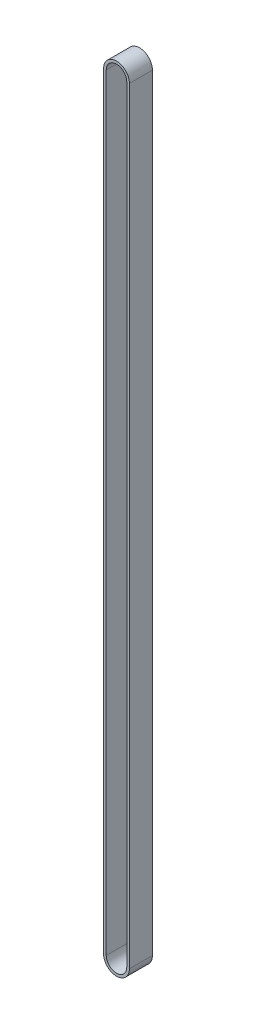
ISO-10303-21;
HEADER;
FILE_DESCRIPTION(('STEP AP214'),'2;1');
FILE_NAME('part.step','',(''),(''),'','','');
FILE_SCHEMA(('AUTOMOTIVE_DESIGN { 1 0 10303 214 1 1 1 1 }'));
ENDSEC;
DATA;
#1=APPLICATION_CONTEXT('core data for automotive mechanical design processes');
#2=APPLICATION_PROTOCOL_DEFINITION('international standard','automotive_design',2000,#1);
#3=PRODUCT_CONTEXT('',#1,'mechanical');
#4=PRODUCT('Part','Part','',(#3));
#5=PRODUCT_RELATED_PRODUCT_CATEGORY('part','',(#4));
#6=PRODUCT_DEFINITION_FORMATION('','',#4);
#7=PRODUCT_DEFINITION_CONTEXT('part definition',#1,'design');
#8=PRODUCT_DEFINITION('design','',#6,#7);
#9=PRODUCT_DEFINITION_SHAPE('','',#8);
#10=(LENGTH_UNIT() NAMED_UNIT(*) SI_UNIT(.MILLI.,.METRE.));
#11=(NAMED_UNIT(*) PLANE_ANGLE_UNIT() SI_UNIT($,.RADIAN.));
#12=(NAMED_UNIT(*) SI_UNIT($,.STERADIAN.) SOLID_ANGLE_UNIT());
#13=UNCERTAINTY_MEASURE_WITH_UNIT(LENGTH_MEASURE(1.E-05),#10,'distance_accuracy_value','');
#14=(GEOMETRIC_REPRESENTATION_CONTEXT(3) GLOBAL_UNCERTAINTY_ASSIGNED_CONTEXT((#13)) GLOBAL_UNIT_ASSIGNED_CONTEXT((#10,
#11,#12)) REPRESENTATION_CONTEXT('',''));
#15=CARTESIAN_POINT('',(0.,0.,0.));
#16=DIRECTION('',(0.,0.,1.));
#17=DIRECTION('',(1.,0.,0.));
#18=AXIS2_PLACEMENT_3D('',#15,#16,#17);
#19=CARTESIAN_POINT('',(0.,0.,12.));
#20=DIRECTION('',(0.,0.,1.));
#21=DIRECTION('',(1.,0.,0.));
#22=AXIS2_PLACEMENT_3D('',#19,#20,#21);
#23=PLANE('',#22);
#24=CARTESIAN_POINT('',(0.,0.,12.));
#25=DIRECTION('',(0.,0.,1.));
#26=DIRECTION('',(1.,0.,0.));
#27=AXIS2_PLACEMENT_3D('',#24,#25,#26);
#28=CIRCLE('',#27,6.741);
#29=CARTESIAN_POINT('',(6.741,0.,12.));
#30=VERTEX_POINT('',#29);
#31=CARTESIAN_POINT('',(-6.741,0.,12.));
#32=VERTEX_POINT('',#31);
#33=EDGE_CURVE('E179',#30,#32,#28,.T.);
#34=ORIENTED_EDGE('',*,*,#33,.T.);
#35=DIRECTION('',(0.,-1.,0.));
#36=VECTOR('',#35,1.);
#37=CARTESIAN_POINT('',(-6.741,0.,12.));
#38=LINE('',#37,#36);
#39=CARTESIAN_POINT('',(-6.74099999999995,-400.,12.));
#40=VERTEX_POINT('',#39);
#41=EDGE_CURVE('E183',#32,#40,#38,.T.);
#42=ORIENTED_EDGE('',*,*,#41,.T.);
#43=CARTESIAN_POINT('',(0.,-400.,12.));
#44=DIRECTION('',(0.,0.,1.));
#45=DIRECTION('',(1.,0.,0.));
#46=AXIS2_PLACEMENT_3D('',#43,#44,#45);
#47=CIRCLE('',#46,6.74099999999995);
#48=CARTESIAN_POINT('',(6.74099999999995,-400.,12.));
#49=VERTEX_POINT('',#48);
#50=EDGE_CURVE('E187',#40,#49,#47,.T.);
#51=ORIENTED_EDGE('',*,*,#50,.T.);
#52=DIRECTION('',(0.,1.,0.));
#53=VECTOR('',#52,1.);
#54=CARTESIAN_POINT('',(6.74099999999995,-400.,12.));
#55=LINE('',#54,#53);
#56=EDGE_CURVE('E190',#49,#30,#55,.T.);
#57=ORIENTED_EDGE('',*,*,#56,.T.);
#58=EDGE_LOOP('',(#34,#42,#51,#57));
#59=FACE_BOUND('',#58,.T.);
#60=DIRECTION('',(0.,-1.,0.));
#61=VECTOR('',#60,1.);
#62=CARTESIAN_POINT('',(-5.361,0.,12.));
#63=LINE('',#62,#61);
#64=CARTESIAN_POINT('',(-5.361,0.,12.));
#65=VERTEX_POINT('',#64);
#66=CARTESIAN_POINT('',(-5.36099999999995,-400.,12.));
#67=VERTEX_POINT('',#66);
#68=EDGE_CURVE('E140',#65,#67,#63,.T.);
#69=ORIENTED_EDGE('',*,*,#68,.F.);
#70=CARTESIAN_POINT('',(0.,0.,12.));
#71=DIRECTION('',(0.,0.,1.));
#72=DIRECTION('',(1.,0.,0.));
#73=AXIS2_PLACEMENT_3D('',#70,#71,#72);
#74=CIRCLE('',#73,5.361);
#75=CARTESIAN_POINT('',(5.361,0.,12.));
#76=VERTEX_POINT('',#75);
#77=EDGE_CURVE('E131',#76,#65,#74,.T.);
#78=ORIENTED_EDGE('',*,*,#77,.F.);
#79=DIRECTION('',(0.,1.,0.));
#80=VECTOR('',#79,1.);
#81=CARTESIAN_POINT('',(5.36099999999995,-400.,12.));
#82=LINE('',#81,#80);
#83=CARTESIAN_POINT('',(5.36099999999995,-400.,12.));
#84=VERTEX_POINT('',#83);
#85=EDGE_CURVE('E157',#84,#76,#82,.T.);
#86=ORIENTED_EDGE('',*,*,#85,.F.);
#87=CARTESIAN_POINT('',(0.,-400.,12.));
#88=DIRECTION('',(0.,0.,1.));
#89=DIRECTION('',(1.,0.,0.));
#90=AXIS2_PLACEMENT_3D('',#87,#88,#89);
#91=CIRCLE('',#90,5.36099999999995);
#92=EDGE_CURVE('E153',#67,#84,#91,.T.);
#93=ORIENTED_EDGE('',*,*,#92,.F.);
#94=EDGE_LOOP('',(#69,#78,#86,#93));
#95=FACE_BOUND('',#94,.T.);
#96=ADVANCED_FACE('F65',(#59,#95),#23,.T.);
#97=CARTESIAN_POINT('',(0.,0.,0.));
#98=DIRECTION('',(0.,0.,1.));
#99=DIRECTION('',(1.,0.,0.));
#100=AXIS2_PLACEMENT_3D('',#97,#98,#99);
#101=PLANE('',#100);
#102=CARTESIAN_POINT('',(0.,0.,0.));
#103=DIRECTION('',(0.,0.,1.));
#104=DIRECTION('',(1.,0.,0.));
#105=AXIS2_PLACEMENT_3D('',#102,#103,#104);
#106=CIRCLE('',#105,6.741);
#107=CARTESIAN_POINT('',(6.741,0.,0.));
#108=VERTEX_POINT('',#107);
#109=CARTESIAN_POINT('',(-6.741,0.,0.));
#110=VERTEX_POINT('',#109);
#111=EDGE_CURVE('E149',#108,#110,#106,.T.);
#112=ORIENTED_EDGE('',*,*,#111,.F.);
#113=DIRECTION('',(0.,1.,0.));
#114=VECTOR('',#113,1.);
#115=CARTESIAN_POINT('',(6.74099999999995,-400.,0.));
#116=LINE('',#115,#114);
#117=CARTESIAN_POINT('',(6.74099999999995,-400.,0.));
#118=VERTEX_POINT('',#117);
#119=EDGE_CURVE('E184',#118,#108,#116,.T.);
#120=ORIENTED_EDGE('',*,*,#119,.F.);
#121=CARTESIAN_POINT('',(0.,-400.,0.));
#122=DIRECTION('',(0.,0.,1.));
#123=DIRECTION('',(1.,0.,0.));
#124=AXIS2_PLACEMENT_3D('',#121,#122,#123);
#125=CIRCLE('',#124,6.74099999999995);
#126=CARTESIAN_POINT('',(-6.74099999999995,-400.,0.));
#127=VERTEX_POINT('',#126);
#128=EDGE_CURVE('E200',#127,#118,#125,.T.);
#129=ORIENTED_EDGE('',*,*,#128,.F.);
#130=DIRECTION('',(0.,-1.,0.));
#131=VECTOR('',#130,1.);
#132=CARTESIAN_POINT('',(-6.741,0.,0.));
#133=LINE('',#132,#131);
#134=EDGE_CURVE('E197',#110,#127,#133,.T.);
#135=ORIENTED_EDGE('',*,*,#134,.F.);
#136=EDGE_LOOP('',(#112,#120,#129,#135));
#137=FACE_BOUND('',#136,.T.);
#138=CARTESIAN_POINT('',(0.,0.,0.));
#139=DIRECTION('',(0.,0.,1.));
#140=DIRECTION('',(1.,0.,0.));
#141=AXIS2_PLACEMENT_3D('',#138,#139,#140);
#142=CIRCLE('',#141,5.361);
#143=CARTESIAN_POINT('',(5.361,0.,0.));
#144=VERTEX_POINT('',#143);
#145=CARTESIAN_POINT('',(-5.361,0.,0.));
#146=VERTEX_POINT('',#145);
#147=EDGE_CURVE('E89',#144,#146,#142,.T.);
#148=ORIENTED_EDGE('',*,*,#147,.T.);
#149=DIRECTION('',(0.,-1.,0.));
#150=VECTOR('',#149,1.);
#151=CARTESIAN_POINT('',(-5.361,0.,0.));
#152=LINE('',#151,#150);
#153=CARTESIAN_POINT('',(-5.36099999999995,-400.,0.));
#154=VERTEX_POINT('',#153);
#155=EDGE_CURVE('E147',#146,#154,#152,.T.);
#156=ORIENTED_EDGE('',*,*,#155,.T.);
#157=CARTESIAN_POINT('',(0.,-400.,0.));
#158=DIRECTION('',(0.,0.,1.));
#159=DIRECTION('',(1.,0.,0.));
#160=AXIS2_PLACEMENT_3D('',#157,#158,#159);
#161=CIRCLE('',#160,5.36099999999995);
#162=CARTESIAN_POINT('',(5.36099999999995,-400.,0.));
#163=VERTEX_POINT('',#162);
#164=EDGE_CURVE('E166',#154,#163,#161,.T.);
#165=ORIENTED_EDGE('',*,*,#164,.T.);
#166=DIRECTION('',(0.,1.,0.));
#167=VECTOR('',#166,1.);
#168=CARTESIAN_POINT('',(5.36099999999995,-400.,0.));
#169=LINE('',#168,#167);
#170=EDGE_CURVE('E141',#163,#144,#169,.T.);
#171=ORIENTED_EDGE('',*,*,#170,.T.);
#172=EDGE_LOOP('',(#148,#156,#165,#171));
#173=FACE_BOUND('',#172,.T.);
#174=ADVANCED_FACE('F223',(#137,#173),#101,.F.);
#175=CARTESIAN_POINT('',(0.,0.,12.));
#176=DIRECTION('',(0.,0.,-1.));
#177=DIRECTION('',(-1.,0.,0.));
#178=AXIS2_PLACEMENT_3D('',#175,#176,#177);
#179=CYLINDRICAL_SURFACE('',#178,6.741);
#180=ORIENTED_EDGE('',*,*,#111,.T.);
#181=DIRECTION('',(0.,0.,-1.));
#182=VECTOR('',#181,1.);
#183=CARTESIAN_POINT('',(-6.741,0.,12.));
#184=LINE('',#183,#182);
#185=EDGE_CURVE('E12',#32,#110,#184,.T.);
#186=ORIENTED_EDGE('',*,*,#185,.F.);
#187=ORIENTED_EDGE('',*,*,#33,.F.);
#188=DIRECTION('',(0.,0.,-1.));
#189=VECTOR('',#188,1.);
#190=CARTESIAN_POINT('',(6.741,0.,12.));
#191=LINE('',#190,#189);
#192=EDGE_CURVE('E193',#30,#108,#191,.T.);
#193=ORIENTED_EDGE('',*,*,#192,.T.);
#194=EDGE_LOOP('',(#180,#186,#187,#193));
#195=FACE_BOUND('',#194,.T.);
#196=ADVANCED_FACE('F67',(#195),#179,.T.);
#197=CARTESIAN_POINT('',(-6.741,0.,12.));
#198=DIRECTION('',(1.,0.,0.));
#199=DIRECTION('',(0.,1.,0.));
#200=AXIS2_PLACEMENT_3D('',#197,#198,#199);
#201=PLANE('',#200);
#202=ORIENTED_EDGE('',*,*,#134,.T.);
#203=DIRECTION('',(0.,0.,-1.));
#204=VECTOR('',#203,1.);
#205=CARTESIAN_POINT('',(-6.74099999999995,-400.,12.));
#206=LINE('',#205,#204);
#207=EDGE_CURVE('E74',#40,#127,#206,.T.);
#208=ORIENTED_EDGE('',*,*,#207,.F.);
#209=ORIENTED_EDGE('',*,*,#41,.F.);
#210=ORIENTED_EDGE('',*,*,#185,.T.);
#211=EDGE_LOOP('',(#202,#208,#209,#210));
#212=FACE_BOUND('',#211,.T.);
#213=ADVANCED_FACE('F233',(#212),#201,.F.);
#214=CARTESIAN_POINT('',(0.,-400.,12.));
#215=DIRECTION('',(0.,0.,-1.));
#216=DIRECTION('',(-1.,0.,0.));
#217=AXIS2_PLACEMENT_3D('',#214,#215,#216);
#218=CYLINDRICAL_SURFACE('',#217,6.74099999999995);
#219=ORIENTED_EDGE('',*,*,#128,.T.);
#220=DIRECTION('',(0.,0.,-1.));
#221=VECTOR('',#220,1.);
#222=CARTESIAN_POINT('',(6.74099999999995,-400.,12.));
#223=LINE('',#222,#221);
#224=EDGE_CURVE('E208',#49,#118,#223,.T.);
#225=ORIENTED_EDGE('',*,*,#224,.F.);
#226=ORIENTED_EDGE('',*,*,#50,.F.);
#227=ORIENTED_EDGE('',*,*,#207,.T.);
#228=EDGE_LOOP('',(#219,#225,#226,#227));
#229=FACE_BOUND('',#228,.T.);
#230=ADVANCED_FACE('F217',(#229),#218,.T.);
#231=CARTESIAN_POINT('',(6.74099999999995,-400.,12.));
#232=DIRECTION('',(-1.,0.,0.));
#233=DIRECTION('',(0.,-1.,0.));
#234=AXIS2_PLACEMENT_3D('',#231,#232,#233);
#235=PLANE('',#234);
#236=ORIENTED_EDGE('',*,*,#119,.T.);
#237=ORIENTED_EDGE('',*,*,#192,.F.);
#238=ORIENTED_EDGE('',*,*,#56,.F.);
#239=ORIENTED_EDGE('',*,*,#224,.T.);
#240=EDGE_LOOP('',(#236,#237,#238,#239));
#241=FACE_BOUND('',#240,.T.);
#242=ADVANCED_FACE('F227',(#241),#235,.F.);
#243=CARTESIAN_POINT('',(0.,0.,12.));
#244=DIRECTION('',(0.,0.,-1.));
#245=DIRECTION('',(-1.,0.,0.));
#246=AXIS2_PLACEMENT_3D('',#243,#244,#245);
#247=CYLINDRICAL_SURFACE('',#246,5.361);
#248=ORIENTED_EDGE('',*,*,#147,.F.);
#249=DIRECTION('',(0.,0.,-1.));
#250=VECTOR('',#249,1.);
#251=CARTESIAN_POINT('',(5.361,0.,12.));
#252=LINE('',#251,#250);
#253=EDGE_CURVE('E135',#76,#144,#252,.T.);
#254=ORIENTED_EDGE('',*,*,#253,.F.);
#255=ORIENTED_EDGE('',*,*,#77,.T.);
#256=DIRECTION('',(0.,0.,-1.));
#257=VECTOR('',#256,1.);
#258=CARTESIAN_POINT('',(-5.361,0.,12.));
#259=LINE('',#258,#257);
#260=EDGE_CURVE('E134',#65,#146,#259,.T.);
#261=ORIENTED_EDGE('',*,*,#260,.T.);
#262=EDGE_LOOP('',(#248,#254,#255,#261));
#263=FACE_BOUND('',#262,.T.);
#264=ADVANCED_FACE('F133',(#263),#247,.F.);
#265=CARTESIAN_POINT('',(-5.361,0.,12.));
#266=DIRECTION('',(1.,0.,0.));
#267=DIRECTION('',(0.,1.,0.));
#268=AXIS2_PLACEMENT_3D('',#265,#266,#267);
#269=PLANE('',#268);
#270=ORIENTED_EDGE('',*,*,#155,.F.);
#271=ORIENTED_EDGE('',*,*,#260,.F.);
#272=ORIENTED_EDGE('',*,*,#68,.T.);
#273=DIRECTION('',(0.,0.,-1.));
#274=VECTOR('',#273,1.);
#275=CARTESIAN_POINT('',(-5.36099999999995,-400.,12.));
#276=LINE('',#275,#274);
#277=EDGE_CURVE('E150',#67,#154,#276,.T.);
#278=ORIENTED_EDGE('',*,*,#277,.T.);
#279=EDGE_LOOP('',(#270,#271,#272,#278));
#280=FACE_BOUND('',#279,.T.);
#281=ADVANCED_FACE('F144',(#280),#269,.T.);
#282=CARTESIAN_POINT('',(0.,-400.,12.));
#283=DIRECTION('',(0.,0.,-1.));
#284=DIRECTION('',(-1.,0.,0.));
#285=AXIS2_PLACEMENT_3D('',#282,#283,#284);
#286=CYLINDRICAL_SURFACE('',#285,5.36099999999995);
#287=ORIENTED_EDGE('',*,*,#164,.F.);
#288=ORIENTED_EDGE('',*,*,#277,.F.);
#289=ORIENTED_EDGE('',*,*,#92,.T.);
#290=DIRECTION('',(0.,0.,-1.));
#291=VECTOR('',#290,1.);
#292=CARTESIAN_POINT('',(5.36099999999995,-400.,12.));
#293=LINE('',#292,#291);
#294=EDGE_CURVE('E81',#84,#163,#293,.T.);
#295=ORIENTED_EDGE('',*,*,#294,.T.);
#296=EDGE_LOOP('',(#287,#288,#289,#295));
#297=FACE_BOUND('',#296,.T.);
#298=ADVANCED_FACE('F256',(#297),#286,.F.);
#299=CARTESIAN_POINT('',(5.36099999999995,-400.,12.));
#300=DIRECTION('',(-1.,0.,0.));
#301=DIRECTION('',(0.,-1.,0.));
#302=AXIS2_PLACEMENT_3D('',#299,#300,#301);
#303=PLANE('',#302);
#304=ORIENTED_EDGE('',*,*,#170,.F.);
#305=ORIENTED_EDGE('',*,*,#294,.F.);
#306=ORIENTED_EDGE('',*,*,#85,.T.);
#307=ORIENTED_EDGE('',*,*,#253,.T.);
#308=EDGE_LOOP('',(#304,#305,#306,#307));
#309=FACE_BOUND('',#308,.T.);
#310=ADVANCED_FACE('F260',(#309),#303,.T.);
#311=CLOSED_SHELL('',(#96,#174,#196,#213,#230,#242,#264,#281,#298,#310));
#312=MANIFOLD_SOLID_BREP('B2',#311);
#313=ADVANCED_BREP_SHAPE_REPRESENTATION('',(#18,#312),#14);
#314=SHAPE_DEFINITION_REPRESENTATION(#9,#313);
ENDSEC;
END-ISO-10303-21;
